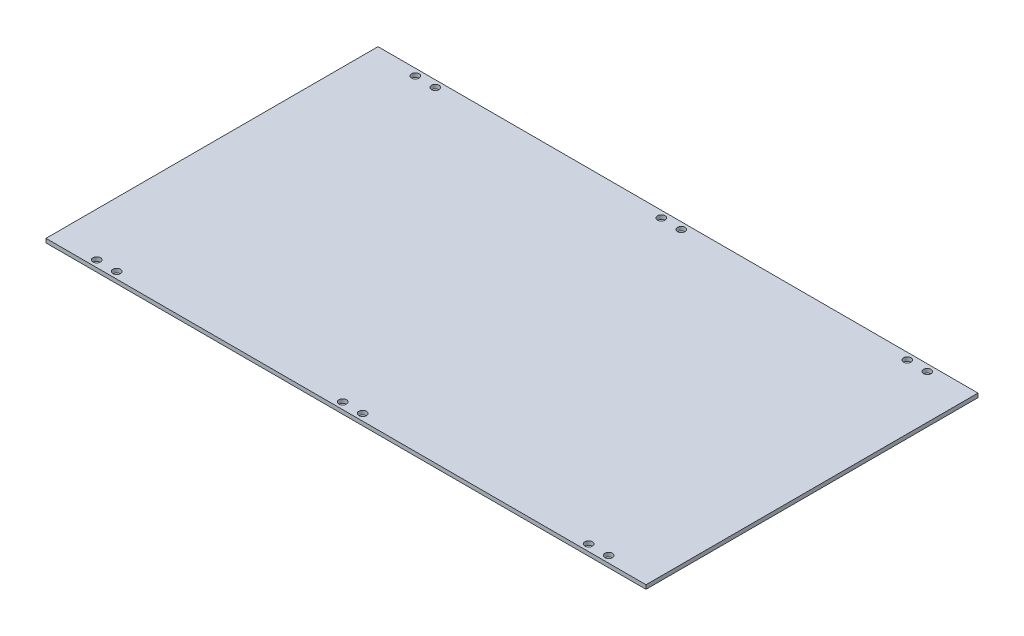
ISO-10303-21;
HEADER;
FILE_DESCRIPTION(('STEP AP214'),'2;1');
FILE_NAME('part.step','',(''),(''),'','','');
FILE_SCHEMA(('AUTOMOTIVE_DESIGN { 1 0 10303 214 1 1 1 1 }'));
ENDSEC;
DATA;
#1=APPLICATION_CONTEXT('core data for automotive mechanical design processes');
#2=APPLICATION_PROTOCOL_DEFINITION('international standard','automotive_design',2000,#1);
#3=PRODUCT_CONTEXT('',#1,'mechanical');
#4=PRODUCT('Part','Part','',(#3));
#5=PRODUCT_RELATED_PRODUCT_CATEGORY('part','',(#4));
#6=PRODUCT_DEFINITION_FORMATION('','',#4);
#7=PRODUCT_DEFINITION_CONTEXT('part definition',#1,'design');
#8=PRODUCT_DEFINITION('design','',#6,#7);
#9=PRODUCT_DEFINITION_SHAPE('','',#8);
#10=(LENGTH_UNIT() NAMED_UNIT(*) SI_UNIT(.MILLI.,.METRE.));
#11=(NAMED_UNIT(*) PLANE_ANGLE_UNIT() SI_UNIT($,.RADIAN.));
#12=(NAMED_UNIT(*) SI_UNIT($,.STERADIAN.) SOLID_ANGLE_UNIT());
#13=UNCERTAINTY_MEASURE_WITH_UNIT(LENGTH_MEASURE(1.E-05),#10,'distance_accuracy_value','');
#14=(GEOMETRIC_REPRESENTATION_CONTEXT(3) GLOBAL_UNCERTAINTY_ASSIGNED_CONTEXT((#13)) GLOBAL_UNIT_ASSIGNED_CONTEXT((#10,
#11,#12)) REPRESENTATION_CONTEXT('',''));
#15=CARTESIAN_POINT('',(0.,0.,0.));
#16=DIRECTION('',(0.,0.,1.));
#17=DIRECTION('',(1.,0.,0.));
#18=AXIS2_PLACEMENT_3D('',#15,#16,#17);
#19=CARTESIAN_POINT('',(150.,2.,83.));
#20=DIRECTION('',(-1.,0.,0.));
#21=DIRECTION('',(0.,0.,1.));
#22=AXIS2_PLACEMENT_3D('',#19,#20,#21);
#23=PLANE('',#22);
#24=DIRECTION('',(0.,0.,-1.));
#25=VECTOR('',#24,1.);
#26=CARTESIAN_POINT('',(150.,0.,83.));
#27=LINE('',#26,#25);
#28=CARTESIAN_POINT('',(150.,0.,83.));
#29=VERTEX_POINT('',#28);
#30=CARTESIAN_POINT('',(150.,0.,-83.));
#31=VERTEX_POINT('',#30);
#32=EDGE_CURVE('E110',#29,#31,#27,.T.);
#33=ORIENTED_EDGE('',*,*,#32,.T.);
#34=DIRECTION('',(0.,-1.,0.));
#35=VECTOR('',#34,1.);
#36=CARTESIAN_POINT('',(150.,2.,-83.));
#37=LINE('',#36,#35);
#38=CARTESIAN_POINT('',(150.,2.,-83.));
#39=VERTEX_POINT('',#38);
#40=EDGE_CURVE('E11',#39,#31,#37,.T.);
#41=ORIENTED_EDGE('',*,*,#40,.F.);
#42=DIRECTION('',(0.,0.,-1.));
#43=VECTOR('',#42,1.);
#44=CARTESIAN_POINT('',(150.,2.,83.));
#45=LINE('',#44,#43);
#46=CARTESIAN_POINT('',(150.,2.,83.));
#47=VERTEX_POINT('',#46);
#48=EDGE_CURVE('E94',#47,#39,#45,.T.);
#49=ORIENTED_EDGE('',*,*,#48,.F.);
#50=DIRECTION('',(0.,-1.,0.));
#51=VECTOR('',#50,1.);
#52=CARTESIAN_POINT('',(150.,2.,83.));
#53=LINE('',#52,#51);
#54=EDGE_CURVE('E106',#47,#29,#53,.T.);
#55=ORIENTED_EDGE('',*,*,#54,.T.);
#56=EDGE_LOOP('',(#33,#41,#49,#55));
#57=FACE_BOUND('',#56,.T.);
#58=ADVANCED_FACE('F42',(#57),#23,.F.);
#59=CARTESIAN_POINT('',(-150.,2.,-83.));
#60=DIRECTION('',(0.,0.,1.));
#61=DIRECTION('',(1.,0.,0.));
#62=AXIS2_PLACEMENT_3D('',#59,#60,#61);
#63=PLANE('',#62);
#64=DIRECTION('',(-1.,0.,0.));
#65=VECTOR('',#64,1.);
#66=CARTESIAN_POINT('',(-150.,0.,-83.));
#67=LINE('',#66,#65);
#68=CARTESIAN_POINT('',(-150.,0.,-83.));
#69=VERTEX_POINT('',#68);
#70=EDGE_CURVE('E99',#31,#69,#67,.T.);
#71=ORIENTED_EDGE('',*,*,#70,.T.);
#72=DIRECTION('',(0.,-1.,0.));
#73=VECTOR('',#72,1.);
#74=CARTESIAN_POINT('',(-150.,2.,-83.));
#75=LINE('',#74,#73);
#76=CARTESIAN_POINT('',(-150.,2.,-83.));
#77=VERTEX_POINT('',#76);
#78=EDGE_CURVE('E51',#77,#69,#75,.T.);
#79=ORIENTED_EDGE('',*,*,#78,.F.);
#80=DIRECTION('',(-1.,0.,0.));
#81=VECTOR('',#80,1.);
#82=CARTESIAN_POINT('',(-150.,2.,-83.));
#83=LINE('',#82,#81);
#84=EDGE_CURVE('E89',#39,#77,#83,.T.);
#85=ORIENTED_EDGE('',*,*,#84,.F.);
#86=ORIENTED_EDGE('',*,*,#40,.T.);
#87=EDGE_LOOP('',(#71,#79,#85,#86));
#88=FACE_BOUND('',#87,.T.);
#89=ADVANCED_FACE('F98',(#88),#63,.F.);
#90=CARTESIAN_POINT('',(-150.,2.,83.));
#91=DIRECTION('',(1.,0.,0.));
#92=DIRECTION('',(0.,0.,-1.));
#93=AXIS2_PLACEMENT_3D('',#90,#91,#92);
#94=PLANE('',#93);
#95=DIRECTION('',(0.,0.,1.));
#96=VECTOR('',#95,1.);
#97=CARTESIAN_POINT('',(-150.,0.,83.));
#98=LINE('',#97,#96);
#99=CARTESIAN_POINT('',(-150.,0.,83.));
#100=VERTEX_POINT('',#99);
#101=EDGE_CURVE('E76',#69,#100,#98,.T.);
#102=ORIENTED_EDGE('',*,*,#101,.T.);
#103=DIRECTION('',(0.,-1.,0.));
#104=VECTOR('',#103,1.);
#105=CARTESIAN_POINT('',(-150.,2.,83.));
#106=LINE('',#105,#104);
#107=CARTESIAN_POINT('',(-150.,2.,83.));
#108=VERTEX_POINT('',#107);
#109=EDGE_CURVE('E101',#108,#100,#106,.T.);
#110=ORIENTED_EDGE('',*,*,#109,.F.);
#111=DIRECTION('',(0.,0.,1.));
#112=VECTOR('',#111,1.);
#113=CARTESIAN_POINT('',(-150.,2.,83.));
#114=LINE('',#113,#112);
#115=EDGE_CURVE('E92',#77,#108,#114,.T.);
#116=ORIENTED_EDGE('',*,*,#115,.F.);
#117=ORIENTED_EDGE('',*,*,#78,.T.);
#118=EDGE_LOOP('',(#102,#110,#116,#117));
#119=FACE_BOUND('',#118,.T.);
#120=ADVANCED_FACE('F102',(#119),#94,.F.);
#121=CARTESIAN_POINT('',(-150.,2.,83.));
#122=DIRECTION('',(0.,0.,-1.));
#123=DIRECTION('',(-1.,0.,0.));
#124=AXIS2_PLACEMENT_3D('',#121,#122,#123);
#125=PLANE('',#124);
#126=DIRECTION('',(1.,0.,0.));
#127=VECTOR('',#126,1.);
#128=CARTESIAN_POINT('',(-150.,0.,83.));
#129=LINE('',#128,#127);
#130=EDGE_CURVE('E82',#100,#29,#129,.T.);
#131=ORIENTED_EDGE('',*,*,#130,.T.);
#132=ORIENTED_EDGE('',*,*,#54,.F.);
#133=DIRECTION('',(1.,0.,0.));
#134=VECTOR('',#133,1.);
#135=CARTESIAN_POINT('',(-150.,2.,83.));
#136=LINE('',#135,#134);
#137=EDGE_CURVE('E59',#108,#47,#136,.T.);
#138=ORIENTED_EDGE('',*,*,#137,.F.);
#139=ORIENTED_EDGE('',*,*,#109,.T.);
#140=EDGE_LOOP('',(#131,#132,#138,#139));
#141=FACE_BOUND('',#140,.T.);
#142=ADVANCED_FACE('F124',(#141),#125,.F.);
#143=CARTESIAN_POINT('',(0.,2.,0.));
#144=DIRECTION('',(0.,-1.,0.));
#145=DIRECTION('',(0.,0.,-1.));
#146=AXIS2_PLACEMENT_3D('',#143,#144,#145);
#147=PLANE('',#146);
#148=CARTESIAN_POINT('',(5.00000000000002,2.,79.65));
#149=DIRECTION('',(0.,1.,0.));
#150=DIRECTION('',(0.,0.,1.));
#151=AXIS2_PLACEMENT_3D('',#148,#149,#150);
#152=CIRCLE('',#151,1.9);
#153=CARTESIAN_POINT('',(5.00000000000002,2.,81.55));
#154=VERTEX_POINT('',#153);
#155=EDGE_CURVE('E171',#154,#154,#152,.T.);
#156=ORIENTED_EDGE('',*,*,#155,.F.);
#157=EDGE_LOOP('',(#156));
#158=FACE_BOUND('',#157,.T.);
#159=CARTESIAN_POINT('',(-118.,2.,-79.6499999999999));
#160=DIRECTION('',(0.,1.,0.));
#161=DIRECTION('',(0.,0.,1.));
#162=AXIS2_PLACEMENT_3D('',#159,#160,#161);
#163=CIRCLE('',#162,1.9);
#164=CARTESIAN_POINT('',(-118.,2.,-77.7499999999999));
#165=VERTEX_POINT('',#164);
#166=EDGE_CURVE('E180',#165,#165,#163,.T.);
#167=ORIENTED_EDGE('',*,*,#166,.F.);
#168=EDGE_LOOP('',(#167));
#169=FACE_BOUND('',#168,.T.);
#170=CARTESIAN_POINT('',(-128.,2.,-79.6499999999999));
#171=DIRECTION('',(0.,1.,0.));
#172=DIRECTION('',(0.,0.,1.));
#173=AXIS2_PLACEMENT_3D('',#170,#171,#172);
#174=CIRCLE('',#173,1.9);
#175=CARTESIAN_POINT('',(-128.,2.,-77.7499999999999));
#176=VERTEX_POINT('',#175);
#177=EDGE_CURVE('E188',#176,#176,#174,.T.);
#178=ORIENTED_EDGE('',*,*,#177,.F.);
#179=EDGE_LOOP('',(#178));
#180=FACE_BOUND('',#179,.T.);
#181=CARTESIAN_POINT('',(-128.,2.,79.65));
#182=DIRECTION('',(0.,1.,0.));
#183=DIRECTION('',(0.,0.,-1.));
#184=AXIS2_PLACEMENT_3D('',#181,#182,#183);
#185=CIRCLE('',#184,1.9);
#186=CARTESIAN_POINT('',(-128.,2.,77.75));
#187=VERTEX_POINT('',#186);
#188=EDGE_CURVE('E196',#187,#187,#185,.T.);
#189=ORIENTED_EDGE('',*,*,#188,.F.);
#190=EDGE_LOOP('',(#189));
#191=FACE_BOUND('',#190,.T.);
#192=CARTESIAN_POINT('',(118.,2.,79.65));
#193=DIRECTION('',(0.,1.,0.));
#194=DIRECTION('',(0.,0.,1.));
#195=AXIS2_PLACEMENT_3D('',#192,#193,#194);
#196=CIRCLE('',#195,1.9);
#197=CARTESIAN_POINT('',(118.,2.,81.55));
#198=VERTEX_POINT('',#197);
#199=EDGE_CURVE('E148',#198,#198,#196,.T.);
#200=ORIENTED_EDGE('',*,*,#199,.F.);
#201=EDGE_LOOP('',(#200));
#202=FACE_BOUND('',#201,.T.);
#203=CARTESIAN_POINT('',(118.,2.,-79.65));
#204=DIRECTION('',(0.,1.,0.));
#205=DIRECTION('',(0.,0.,-1.));
#206=AXIS2_PLACEMENT_3D('',#203,#204,#205);
#207=CIRCLE('',#206,1.9);
#208=CARTESIAN_POINT('',(118.,2.,-81.55));
#209=VERTEX_POINT('',#208);
#210=EDGE_CURVE('E139',#209,#209,#207,.T.);
#211=ORIENTED_EDGE('',*,*,#210,.F.);
#212=EDGE_LOOP('',(#211));
#213=FACE_BOUND('',#212,.T.);
#214=CARTESIAN_POINT('',(128.,2.,-79.65));
#215=DIRECTION('',(0.,1.,0.));
#216=DIRECTION('',(0.,0.,-1.));
#217=AXIS2_PLACEMENT_3D('',#214,#215,#216);
#218=CIRCLE('',#217,1.9);
#219=CARTESIAN_POINT('',(128.,2.,-81.55));
#220=VERTEX_POINT('',#219);
#221=EDGE_CURVE('E164',#220,#220,#218,.T.);
#222=ORIENTED_EDGE('',*,*,#221,.F.);
#223=EDGE_LOOP('',(#222));
#224=FACE_BOUND('',#223,.T.);
#225=CARTESIAN_POINT('',(-118.,2.,79.65));
#226=DIRECTION('',(0.,1.,0.));
#227=DIRECTION('',(0.,0.,-1.));
#228=AXIS2_PLACEMENT_3D('',#225,#226,#227);
#229=CIRCLE('',#228,1.9);
#230=CARTESIAN_POINT('',(-118.,2.,77.75));
#231=VERTEX_POINT('',#230);
#232=EDGE_CURVE('E155',#231,#231,#229,.T.);
#233=ORIENTED_EDGE('',*,*,#232,.F.);
#234=EDGE_LOOP('',(#233));
#235=FACE_BOUND('',#234,.T.);
#236=CARTESIAN_POINT('',(-4.99999999999998,2.,-79.65));
#237=DIRECTION('',(0.,1.,0.));
#238=DIRECTION('',(0.,0.,-1.));
#239=AXIS2_PLACEMENT_3D('',#236,#237,#238);
#240=CIRCLE('',#239,1.9);
#241=CARTESIAN_POINT('',(-4.99999999999998,2.,-81.55));
#242=VERTEX_POINT('',#241);
#243=EDGE_CURVE('E219',#242,#242,#240,.T.);
#244=ORIENTED_EDGE('',*,*,#243,.F.);
#245=EDGE_LOOP('',(#244));
#246=FACE_BOUND('',#245,.T.);
#247=CARTESIAN_POINT('',(-4.99999999999998,2.,79.65));
#248=DIRECTION('',(0.,1.,0.));
#249=DIRECTION('',(0.,0.,1.));
#250=AXIS2_PLACEMENT_3D('',#247,#248,#249);
#251=CIRCLE('',#250,1.9);
#252=CARTESIAN_POINT('',(-4.99999999999998,2.,81.55));
#253=VERTEX_POINT('',#252);
#254=EDGE_CURVE('E203',#253,#253,#251,.T.);
#255=ORIENTED_EDGE('',*,*,#254,.F.);
#256=EDGE_LOOP('',(#255));
#257=FACE_BOUND('',#256,.T.);
#258=CARTESIAN_POINT('',(5.00000000000002,2.,-79.65));
#259=DIRECTION('',(0.,1.,0.));
#260=DIRECTION('',(0.,0.,-1.));
#261=AXIS2_PLACEMENT_3D('',#258,#259,#260);
#262=CIRCLE('',#261,1.9);
#263=CARTESIAN_POINT('',(5.00000000000002,2.,-81.55));
#264=VERTEX_POINT('',#263);
#265=EDGE_CURVE('E212',#264,#264,#262,.T.);
#266=ORIENTED_EDGE('',*,*,#265,.F.);
#267=EDGE_LOOP('',(#266));
#268=FACE_BOUND('',#267,.T.);
#269=CARTESIAN_POINT('',(128.,2.,79.65));
#270=DIRECTION('',(0.,1.,0.));
#271=DIRECTION('',(0.,0.,1.));
#272=AXIS2_PLACEMENT_3D('',#269,#270,#271);
#273=CIRCLE('',#272,1.9);
#274=CARTESIAN_POINT('',(128.,2.,81.55));
#275=VERTEX_POINT('',#274);
#276=EDGE_CURVE('E114',#275,#275,#273,.T.);
#277=ORIENTED_EDGE('',*,*,#276,.F.);
#278=EDGE_LOOP('',(#277));
#279=FACE_BOUND('',#278,.T.);
#280=ORIENTED_EDGE('',*,*,#48,.T.);
#281=ORIENTED_EDGE('',*,*,#84,.T.);
#282=ORIENTED_EDGE('',*,*,#115,.T.);
#283=ORIENTED_EDGE('',*,*,#137,.T.);
#284=EDGE_LOOP('',(#280,#281,#282,#283));
#285=FACE_BOUND('',#284,.T.);
#286=ADVANCED_FACE('F90',(#158,#169,#180,#191,#202,#213,#224,#235,#246,#257,#268,#279,#285),
#147,.F.);
#287=CARTESIAN_POINT('',(0.,0.,0.));
#288=DIRECTION('',(0.,-1.,0.));
#289=DIRECTION('',(0.,0.,-1.));
#290=AXIS2_PLACEMENT_3D('',#287,#288,#289);
#291=PLANE('',#290);
#292=CARTESIAN_POINT('',(5.00000000000002,0.,79.65));
#293=DIRECTION('',(0.,-1.,0.));
#294=DIRECTION('',(0.,0.,-1.));
#295=AXIS2_PLACEMENT_3D('',#292,#293,#294);
#296=CIRCLE('',#295,1.9);
#297=CARTESIAN_POINT('',(5.00000000000002,0.,77.75));
#298=VERTEX_POINT('',#297);
#299=EDGE_CURVE('E175',#298,#298,#296,.F.);
#300=ORIENTED_EDGE('',*,*,#299,.T.);
#301=EDGE_LOOP('',(#300));
#302=FACE_BOUND('',#301,.T.);
#303=CARTESIAN_POINT('',(-118.,0.,-79.6499999999999));
#304=DIRECTION('',(0.,-1.,0.));
#305=DIRECTION('',(0.,0.,-1.));
#306=AXIS2_PLACEMENT_3D('',#303,#304,#305);
#307=CIRCLE('',#306,1.9);
#308=CARTESIAN_POINT('',(-118.,0.,-81.5499999999999));
#309=VERTEX_POINT('',#308);
#310=EDGE_CURVE('E184',#309,#309,#307,.F.);
#311=ORIENTED_EDGE('',*,*,#310,.T.);
#312=EDGE_LOOP('',(#311));
#313=FACE_BOUND('',#312,.T.);
#314=CARTESIAN_POINT('',(-128.,0.,-79.6499999999999));
#315=DIRECTION('',(0.,-1.,0.));
#316=DIRECTION('',(0.,0.,-1.));
#317=AXIS2_PLACEMENT_3D('',#314,#315,#316);
#318=CIRCLE('',#317,1.9);
#319=CARTESIAN_POINT('',(-128.,0.,-81.5499999999999));
#320=VERTEX_POINT('',#319);
#321=EDGE_CURVE('E192',#320,#320,#318,.F.);
#322=ORIENTED_EDGE('',*,*,#321,.T.);
#323=EDGE_LOOP('',(#322));
#324=FACE_BOUND('',#323,.T.);
#325=CARTESIAN_POINT('',(-128.,0.,79.65));
#326=DIRECTION('',(0.,-1.,0.));
#327=DIRECTION('',(0.,0.,-1.));
#328=AXIS2_PLACEMENT_3D('',#325,#326,#327);
#329=CIRCLE('',#328,1.9);
#330=CARTESIAN_POINT('',(-128.,0.,77.75));
#331=VERTEX_POINT('',#330);
#332=EDGE_CURVE('E160',#331,#331,#329,.F.);
#333=ORIENTED_EDGE('',*,*,#332,.T.);
#334=EDGE_LOOP('',(#333));
#335=FACE_BOUND('',#334,.T.);
#336=CARTESIAN_POINT('',(118.,0.,79.65));
#337=DIRECTION('',(0.,-1.,0.));
#338=DIRECTION('',(0.,0.,-1.));
#339=AXIS2_PLACEMENT_3D('',#336,#337,#338);
#340=CIRCLE('',#339,1.9);
#341=CARTESIAN_POINT('',(118.,0.,77.75));
#342=VERTEX_POINT('',#341);
#343=EDGE_CURVE('E135',#342,#342,#340,.F.);
#344=ORIENTED_EDGE('',*,*,#343,.T.);
#345=EDGE_LOOP('',(#344));
#346=FACE_BOUND('',#345,.T.);
#347=CARTESIAN_POINT('',(118.,0.,-79.65));
#348=DIRECTION('',(0.,-1.,0.));
#349=DIRECTION('',(0.,0.,-1.));
#350=AXIS2_PLACEMENT_3D('',#347,#348,#349);
#351=CIRCLE('',#350,1.9);
#352=CARTESIAN_POINT('',(118.,0.,-81.55));
#353=VERTEX_POINT('',#352);
#354=EDGE_CURVE('E143',#353,#353,#351,.F.);
#355=ORIENTED_EDGE('',*,*,#354,.T.);
#356=EDGE_LOOP('',(#355));
#357=FACE_BOUND('',#356,.T.);
#358=CARTESIAN_POINT('',(128.,0.,-79.65));
#359=DIRECTION('',(0.,-1.,0.));
#360=DIRECTION('',(0.,0.,-1.));
#361=AXIS2_PLACEMENT_3D('',#358,#359,#360);
#362=CIRCLE('',#361,1.9);
#363=CARTESIAN_POINT('',(128.,0.,-81.55));
#364=VERTEX_POINT('',#363);
#365=EDGE_CURVE('E144',#364,#364,#362,.F.);
#366=ORIENTED_EDGE('',*,*,#365,.T.);
#367=EDGE_LOOP('',(#366));
#368=FACE_BOUND('',#367,.T.);
#369=CARTESIAN_POINT('',(-118.,0.,79.65));
#370=DIRECTION('',(0.,-1.,0.));
#371=DIRECTION('',(0.,0.,-1.));
#372=AXIS2_PLACEMENT_3D('',#369,#370,#371);
#373=CIRCLE('',#372,1.9);
#374=CARTESIAN_POINT('',(-118.,0.,77.75));
#375=VERTEX_POINT('',#374);
#376=EDGE_CURVE('E159',#375,#375,#373,.F.);
#377=ORIENTED_EDGE('',*,*,#376,.T.);
#378=EDGE_LOOP('',(#377));
#379=FACE_BOUND('',#378,.T.);
#380=CARTESIAN_POINT('',(-4.99999999999998,0.,-79.65));
#381=DIRECTION('',(0.,-1.,0.));
#382=DIRECTION('',(0.,0.,-1.));
#383=AXIS2_PLACEMENT_3D('',#380,#381,#382);
#384=CIRCLE('',#383,1.9);
#385=CARTESIAN_POINT('',(-4.99999999999998,0.,-81.55));
#386=VERTEX_POINT('',#385);
#387=EDGE_CURVE('E208',#386,#386,#384,.F.);
#388=ORIENTED_EDGE('',*,*,#387,.T.);
#389=EDGE_LOOP('',(#388));
#390=FACE_BOUND('',#389,.T.);
#391=CARTESIAN_POINT('',(-4.99999999999998,0.,79.65));
#392=DIRECTION('',(0.,-1.,0.));
#393=DIRECTION('',(0.,0.,-1.));
#394=AXIS2_PLACEMENT_3D('',#391,#392,#393);
#395=CIRCLE('',#394,1.9);
#396=CARTESIAN_POINT('',(-4.99999999999998,0.,77.75));
#397=VERTEX_POINT('',#396);
#398=EDGE_CURVE('E207',#397,#397,#395,.F.);
#399=ORIENTED_EDGE('',*,*,#398,.T.);
#400=EDGE_LOOP('',(#399));
#401=FACE_BOUND('',#400,.T.);
#402=CARTESIAN_POINT('',(5.00000000000002,0.,-79.65));
#403=DIRECTION('',(0.,-1.,0.));
#404=DIRECTION('',(0.,0.,-1.));
#405=AXIS2_PLACEMENT_3D('',#402,#403,#404);
#406=CIRCLE('',#405,1.9);
#407=CARTESIAN_POINT('',(5.00000000000002,0.,-81.55));
#408=VERTEX_POINT('',#407);
#409=EDGE_CURVE('E176',#408,#408,#406,.F.);
#410=ORIENTED_EDGE('',*,*,#409,.T.);
#411=EDGE_LOOP('',(#410));
#412=FACE_BOUND('',#411,.T.);
#413=CARTESIAN_POINT('',(128.,0.,79.65));
#414=DIRECTION('',(0.,-1.,0.));
#415=DIRECTION('',(0.,0.,-1.));
#416=AXIS2_PLACEMENT_3D('',#413,#414,#415);
#417=CIRCLE('',#416,1.9);
#418=CARTESIAN_POINT('',(128.,0.,77.75));
#419=VERTEX_POINT('',#418);
#420=EDGE_CURVE('E131',#419,#419,#417,.F.);
#421=ORIENTED_EDGE('',*,*,#420,.T.);
#422=EDGE_LOOP('',(#421));
#423=FACE_BOUND('',#422,.T.);
#424=ORIENTED_EDGE('',*,*,#32,.F.);
#425=ORIENTED_EDGE('',*,*,#130,.F.);
#426=ORIENTED_EDGE('',*,*,#101,.F.);
#427=ORIENTED_EDGE('',*,*,#70,.F.);
#428=EDGE_LOOP('',(#424,#425,#426,#427));
#429=FACE_BOUND('',#428,.T.);
#430=ADVANCED_FACE('F127',(#302,#313,#324,#335,#346,#357,#368,#379,#390,#401,#412,#423,#429),
#291,.T.);
#431=CARTESIAN_POINT('',(128.,-0.00100000000000013,79.65));
#432=DIRECTION('',(0.,1.,0.));
#433=DIRECTION('',(0.,0.,1.));
#434=AXIS2_PLACEMENT_3D('',#431,#432,#433);
#435=CYLINDRICAL_SURFACE('',#434,1.9);
#436=ORIENTED_EDGE('',*,*,#420,.F.);
#437=EDGE_LOOP('',(#436));
#438=FACE_BOUND('',#437,.T.);
#439=ORIENTED_EDGE('',*,*,#276,.T.);
#440=EDGE_LOOP('',(#439));
#441=FACE_BOUND('',#440,.T.);
#442=ADVANCED_FACE('F247',(#438,#441),#435,.F.);
#443=CARTESIAN_POINT('',(5.00000000000002,-0.00100000000000013,-79.65));
#444=DIRECTION('',(0.,1.,0.));
#445=DIRECTION('',(0.,0.,1.));
#446=AXIS2_PLACEMENT_3D('',#443,#444,#445);
#447=CYLINDRICAL_SURFACE('',#446,1.9);
#448=ORIENTED_EDGE('',*,*,#409,.F.);
#449=EDGE_LOOP('',(#448));
#450=FACE_BOUND('',#449,.T.);
#451=ORIENTED_EDGE('',*,*,#265,.T.);
#452=EDGE_LOOP('',(#451));
#453=FACE_BOUND('',#452,.T.);
#454=ADVANCED_FACE('F249',(#450,#453),#447,.F.);
#455=CARTESIAN_POINT('',(-4.99999999999998,-0.00100000000000013,79.65));
#456=DIRECTION('',(0.,1.,0.));
#457=DIRECTION('',(0.,0.,1.));
#458=AXIS2_PLACEMENT_3D('',#455,#456,#457);
#459=CYLINDRICAL_SURFACE('',#458,1.9);
#460=ORIENTED_EDGE('',*,*,#398,.F.);
#461=EDGE_LOOP('',(#460));
#462=FACE_BOUND('',#461,.T.);
#463=ORIENTED_EDGE('',*,*,#254,.T.);
#464=EDGE_LOOP('',(#463));
#465=FACE_BOUND('',#464,.T.);
#466=ADVANCED_FACE('F233',(#462,#465),#459,.F.);
#467=CARTESIAN_POINT('',(-4.99999999999998,-0.00100000000000013,-79.65));
#468=DIRECTION('',(0.,1.,0.));
#469=DIRECTION('',(0.,0.,1.));
#470=AXIS2_PLACEMENT_3D('',#467,#468,#469);
#471=CYLINDRICAL_SURFACE('',#470,1.9);
#472=ORIENTED_EDGE('',*,*,#387,.F.);
#473=EDGE_LOOP('',(#472));
#474=FACE_BOUND('',#473,.T.);
#475=ORIENTED_EDGE('',*,*,#243,.T.);
#476=EDGE_LOOP('',(#475));
#477=FACE_BOUND('',#476,.T.);
#478=ADVANCED_FACE('F229',(#474,#477),#471,.F.);
#479=CARTESIAN_POINT('',(-118.,-0.00100000000000013,79.65));
#480=DIRECTION('',(0.,1.,0.));
#481=DIRECTION('',(0.,0.,1.));
#482=AXIS2_PLACEMENT_3D('',#479,#480,#481);
#483=CYLINDRICAL_SURFACE('',#482,1.9);
#484=ORIENTED_EDGE('',*,*,#376,.F.);
#485=EDGE_LOOP('',(#484));
#486=FACE_BOUND('',#485,.T.);
#487=ORIENTED_EDGE('',*,*,#232,.T.);
#488=EDGE_LOOP('',(#487));
#489=FACE_BOUND('',#488,.T.);
#490=ADVANCED_FACE('F232',(#486,#489),#483,.F.);
#491=CARTESIAN_POINT('',(128.,-0.00100000000000013,-79.65));
#492=DIRECTION('',(0.,1.,0.));
#493=DIRECTION('',(0.,0.,1.));
#494=AXIS2_PLACEMENT_3D('',#491,#492,#493);
#495=CYLINDRICAL_SURFACE('',#494,1.9);
#496=ORIENTED_EDGE('',*,*,#365,.F.);
#497=EDGE_LOOP('',(#496));
#498=FACE_BOUND('',#497,.T.);
#499=ORIENTED_EDGE('',*,*,#221,.T.);
#500=EDGE_LOOP('',(#499));
#501=FACE_BOUND('',#500,.T.);
#502=ADVANCED_FACE('F326',(#498,#501),#495,.F.);
#503=CARTESIAN_POINT('',(118.,-0.00100000000000013,-79.65));
#504=DIRECTION('',(0.,1.,0.));
#505=DIRECTION('',(0.,0.,1.));
#506=AXIS2_PLACEMENT_3D('',#503,#504,#505);
#507=CYLINDRICAL_SURFACE('',#506,1.9);
#508=ORIENTED_EDGE('',*,*,#354,.F.);
#509=EDGE_LOOP('',(#508));
#510=FACE_BOUND('',#509,.T.);
#511=ORIENTED_EDGE('',*,*,#210,.T.);
#512=EDGE_LOOP('',(#511));
#513=FACE_BOUND('',#512,.T.);
#514=ADVANCED_FACE('F337',(#510,#513),#507,.F.);
#515=CARTESIAN_POINT('',(118.,-0.00100000000000013,79.65));
#516=DIRECTION('',(0.,1.,0.));
#517=DIRECTION('',(0.,0.,1.));
#518=AXIS2_PLACEMENT_3D('',#515,#516,#517);
#519=CYLINDRICAL_SURFACE('',#518,1.9);
#520=ORIENTED_EDGE('',*,*,#343,.F.);
#521=EDGE_LOOP('',(#520));
#522=FACE_BOUND('',#521,.T.);
#523=ORIENTED_EDGE('',*,*,#199,.T.);
#524=EDGE_LOOP('',(#523));
#525=FACE_BOUND('',#524,.T.);
#526=ADVANCED_FACE('F348',(#522,#525),#519,.F.);
#527=CARTESIAN_POINT('',(-128.,-0.00100000000000013,79.65));
#528=DIRECTION('',(0.,1.,0.));
#529=DIRECTION('',(0.,0.,1.));
#530=AXIS2_PLACEMENT_3D('',#527,#528,#529);
#531=CYLINDRICAL_SURFACE('',#530,1.9);
#532=ORIENTED_EDGE('',*,*,#332,.F.);
#533=EDGE_LOOP('',(#532));
#534=FACE_BOUND('',#533,.T.);
#535=ORIENTED_EDGE('',*,*,#188,.T.);
#536=EDGE_LOOP('',(#535));
#537=FACE_BOUND('',#536,.T.);
#538=ADVANCED_FACE('F358',(#534,#537),#531,.F.);
#539=CARTESIAN_POINT('',(-128.,-0.00100000000000013,-79.6499999999999));
#540=DIRECTION('',(0.,1.,0.));
#541=DIRECTION('',(0.,0.,1.));
#542=AXIS2_PLACEMENT_3D('',#539,#540,#541);
#543=CYLINDRICAL_SURFACE('',#542,1.9);
#544=ORIENTED_EDGE('',*,*,#321,.F.);
#545=EDGE_LOOP('',(#544));
#546=FACE_BOUND('',#545,.T.);
#547=ORIENTED_EDGE('',*,*,#177,.T.);
#548=EDGE_LOOP('',(#547));
#549=FACE_BOUND('',#548,.T.);
#550=ADVANCED_FACE('F369',(#546,#549),#543,.F.);
#551=CARTESIAN_POINT('',(-118.,-0.00100000000000013,-79.6499999999999));
#552=DIRECTION('',(0.,1.,0.));
#553=DIRECTION('',(0.,0.,1.));
#554=AXIS2_PLACEMENT_3D('',#551,#552,#553);
#555=CYLINDRICAL_SURFACE('',#554,1.9);
#556=ORIENTED_EDGE('',*,*,#310,.F.);
#557=EDGE_LOOP('',(#556));
#558=FACE_BOUND('',#557,.T.);
#559=ORIENTED_EDGE('',*,*,#166,.T.);
#560=EDGE_LOOP('',(#559));
#561=FACE_BOUND('',#560,.T.);
#562=ADVANCED_FACE('F380',(#558,#561),#555,.F.);
#563=CARTESIAN_POINT('',(5.00000000000002,-0.00100000000000013,79.65));
#564=DIRECTION('',(0.,1.,0.));
#565=DIRECTION('',(0.,0.,1.));
#566=AXIS2_PLACEMENT_3D('',#563,#564,#565);
#567=CYLINDRICAL_SURFACE('',#566,1.9);
#568=ORIENTED_EDGE('',*,*,#299,.F.);
#569=EDGE_LOOP('',(#568));
#570=FACE_BOUND('',#569,.T.);
#571=ORIENTED_EDGE('',*,*,#155,.T.);
#572=EDGE_LOOP('',(#571));
#573=FACE_BOUND('',#572,.T.);
#574=ADVANCED_FACE('F391',(#570,#573),#567,.F.);
#575=CLOSED_SHELL('',(#58,#89,#120,#142,#286,#430,#442,#454,#466,#478,#490,#502,#514,#526,#538,
#550,#562,#574));
#576=MANIFOLD_SOLID_BREP('B2',#575);
#577=ADVANCED_BREP_SHAPE_REPRESENTATION('',(#18,#576),#14);
#578=SHAPE_DEFINITION_REPRESENTATION(#9,#577);
ENDSEC;
END-ISO-10303-21;
